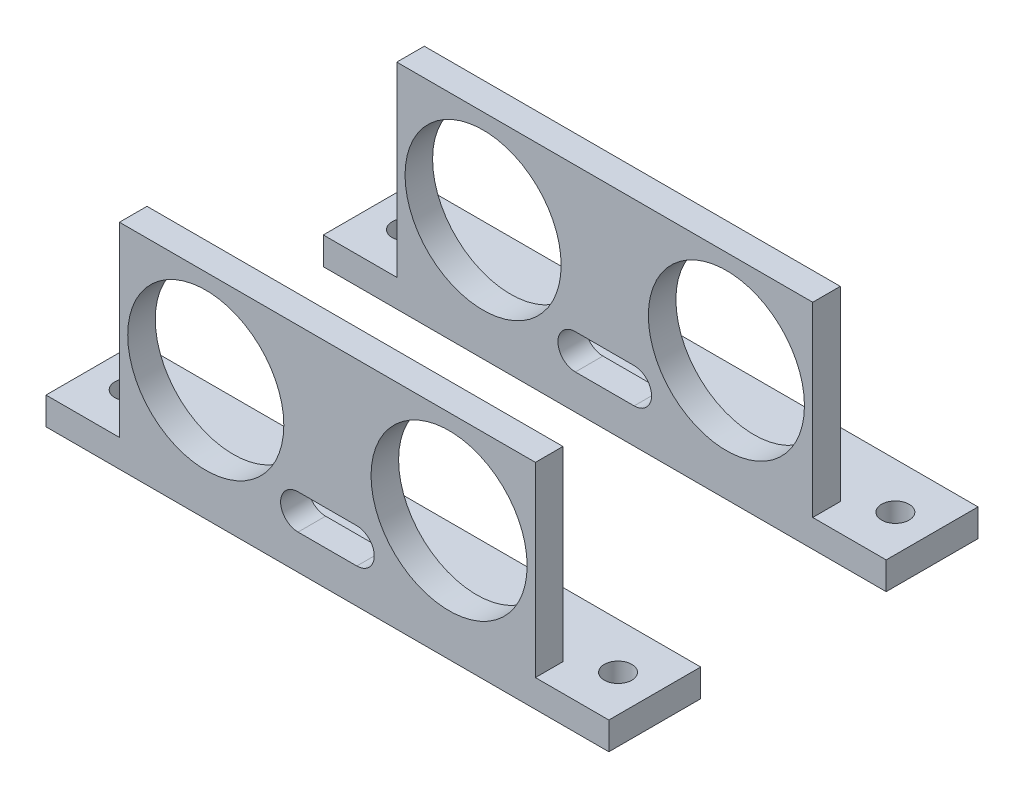
ISO-10303-21;
HEADER;
FILE_DESCRIPTION(('STEP AP214'),'2;1');
FILE_NAME('part.step','',(''),(''),'','','');
FILE_SCHEMA(('AUTOMOTIVE_DESIGN { 1 0 10303 214 1 1 1 1 }'));
ENDSEC;
DATA;
#1=APPLICATION_CONTEXT('core data for automotive mechanical design processes');
#2=APPLICATION_PROTOCOL_DEFINITION('international standard','automotive_design',2000,#1);
#3=PRODUCT_CONTEXT('',#1,'mechanical');
#4=PRODUCT('Part','Part','',(#3));
#5=PRODUCT_RELATED_PRODUCT_CATEGORY('part','',(#4));
#6=PRODUCT_DEFINITION_FORMATION('','',#4);
#7=PRODUCT_DEFINITION_CONTEXT('part definition',#1,'design');
#8=PRODUCT_DEFINITION('design','',#6,#7);
#9=PRODUCT_DEFINITION_SHAPE('','',#8);
#10=(LENGTH_UNIT() NAMED_UNIT(*) SI_UNIT(.MILLI.,.METRE.));
#11=(NAMED_UNIT(*) PLANE_ANGLE_UNIT() SI_UNIT($,.RADIAN.));
#12=(NAMED_UNIT(*) SI_UNIT($,.STERADIAN.) SOLID_ANGLE_UNIT());
#13=UNCERTAINTY_MEASURE_WITH_UNIT(LENGTH_MEASURE(1.E-05),#10,'distance_accuracy_value','');
#14=(GEOMETRIC_REPRESENTATION_CONTEXT(3) GLOBAL_UNCERTAINTY_ASSIGNED_CONTEXT((#13)) GLOBAL_UNIT_ASSIGNED_CONTEXT((#10,
#11,#12)) REPRESENTATION_CONTEXT('',''));
#15=CARTESIAN_POINT('',(0.,0.,0.));
#16=DIRECTION('',(0.,0.,1.));
#17=DIRECTION('',(1.,0.,0.));
#18=AXIS2_PLACEMENT_3D('',#15,#16,#17);
#19=CARTESIAN_POINT('',(98.6393724543672,-8.15776135163671,-20.2023665573039));
#20=DIRECTION('',(0.,-1.,0.));
#21=DIRECTION('',(1.,0.,0.));
#22=AXIS2_PLACEMENT_3D('',#19,#20,#21);
#23=PLANE('',#22);
#24=CARTESIAN_POINT('',(-57.3606275456328,-8.15776135163673,-25.2023665573039));
#25=DIRECTION('',(0.,-1.,0.));
#26=DIRECTION('',(1.,0.,0.));
#27=AXIS2_PLACEMENT_3D('',#24,#25,#26);
#28=CIRCLE('',#27,1.5);
#29=CARTESIAN_POINT('',(-55.8606275456328,-8.15776135163673,-25.2023665573039));
#30=VERTEX_POINT('',#29);
#31=EDGE_CURVE('E161',#30,#30,#28,.T.);
#32=ORIENTED_EDGE('',*,*,#31,.T.);
#33=EDGE_LOOP('',(#32));
#34=FACE_BOUND('',#33,.T.);
#35=CARTESIAN_POINT('',(-4.06062754563281,-8.15776135163673,-25.2023665573039));
#36=DIRECTION('',(0.,-1.,0.));
#37=DIRECTION('',(1.,0.,0.));
#38=AXIS2_PLACEMENT_3D('',#35,#36,#37);
#39=CIRCLE('',#38,1.5);
#40=CARTESIAN_POINT('',(-2.56062754563281,-8.15776135163673,-25.2023665573039));
#41=VERTEX_POINT('',#40);
#42=EDGE_CURVE('E247',#41,#41,#39,.T.);
#43=ORIENTED_EDGE('',*,*,#42,.T.);
#44=EDGE_LOOP('',(#43));
#45=FACE_BOUND('',#44,.T.);
#46=DIRECTION('',(-1.,0.,0.));
#47=VECTOR('',#46,1.);
#48=CARTESIAN_POINT('',(98.6393724543672,-8.15776135163671,-30.2023665573039));
#49=LINE('',#48,#47);
#50=CARTESIAN_POINT('',(-0.0606275456328146,-8.15776135163673,-30.2023665573039));
#51=VERTEX_POINT('',#50);
#52=CARTESIAN_POINT('',(-61.3606275456328,-8.15776135163673,-30.2023665573039));
#53=VERTEX_POINT('',#52);
#54=EDGE_CURVE('E150',#51,#53,#49,.T.);
#55=ORIENTED_EDGE('',*,*,#54,.T.);
#56=DIRECTION('',(0.,0.,-1.));
#57=VECTOR('',#56,1.);
#58=CARTESIAN_POINT('',(-61.3606275456328,-8.15776135163673,-30.2023665573039));
#59=LINE('',#58,#57);
#60=CARTESIAN_POINT('',(-61.3606275456328,-8.15776135163673,-20.2023665573039));
#61=VERTEX_POINT('',#60);
#62=EDGE_CURVE('E168',#61,#53,#59,.T.);
#63=ORIENTED_EDGE('',*,*,#62,.F.);
#64=DIRECTION('',(-1.,0.,0.));
#65=VECTOR('',#64,1.);
#66=CARTESIAN_POINT('',(-53.3606275456328,-8.15776135163673,-20.2023665573039));
#67=LINE('',#66,#65);
#68=CARTESIAN_POINT('',(-53.3606275456328,-8.15776135163673,-20.2023665573039));
#69=VERTEX_POINT('',#68);
#70=EDGE_CURVE('E65',#69,#61,#67,.T.);
#71=ORIENTED_EDGE('',*,*,#70,.F.);
#72=DIRECTION('',(0.,0.,1.));
#73=VECTOR('',#72,1.);
#74=CARTESIAN_POINT('',(-53.3606275456328,-8.15776135163673,-30.2023665573039));
#75=LINE('',#74,#73);
#76=CARTESIAN_POINT('',(-53.3606275456328,-8.15776135163673,-23.2023665573039));
#77=VERTEX_POINT('',#76);
#78=EDGE_CURVE('E12',#77,#69,#75,.T.);
#79=ORIENTED_EDGE('',*,*,#78,.F.);
#80=DIRECTION('',(-1.,0.,0.));
#81=VECTOR('',#80,1.);
#82=CARTESIAN_POINT('',(-53.3606275456328,-8.15776135163673,-23.2023665573039));
#83=LINE('',#82,#81);
#84=CARTESIAN_POINT('',(-8.06062754563281,-8.15776135163673,-23.2023665573039));
#85=VERTEX_POINT('',#84);
#86=EDGE_CURVE('E221',#85,#77,#83,.T.);
#87=ORIENTED_EDGE('',*,*,#86,.F.);
#88=DIRECTION('',(0.,0.,-1.));
#89=VECTOR('',#88,1.);
#90=CARTESIAN_POINT('',(-8.06062754563281,-8.15776135163673,-30.2023665573039));
#91=LINE('',#90,#89);
#92=CARTESIAN_POINT('',(-8.06062754563281,-8.15776135163673,-20.2023665573039));
#93=VERTEX_POINT('',#92);
#94=EDGE_CURVE('E166',#93,#85,#91,.T.);
#95=ORIENTED_EDGE('',*,*,#94,.F.);
#96=DIRECTION('',(-1.,0.,0.));
#97=VECTOR('',#96,1.);
#98=CARTESIAN_POINT('',(-0.0606275456328146,-8.15776135163673,-20.2023665573039));
#99=LINE('',#98,#97);
#100=CARTESIAN_POINT('',(-0.0606275456328146,-8.15776135163673,-20.2023665573039));
#101=VERTEX_POINT('',#100);
#102=EDGE_CURVE('E173',#101,#93,#99,.T.);
#103=ORIENTED_EDGE('',*,*,#102,.F.);
#104=DIRECTION('',(0.,0.,1.));
#105=VECTOR('',#104,1.);
#106=CARTESIAN_POINT('',(-0.0606275456328146,-8.15776135163673,-30.2023665573039));
#107=LINE('',#106,#105);
#108=EDGE_CURVE('E158',#51,#101,#107,.T.);
#109=ORIENTED_EDGE('',*,*,#108,.F.);
#110=EDGE_LOOP('',(#55,#63,#71,#79,#87,#95,#103,#109));
#111=FACE_BOUND('',#110,.T.);
#112=ADVANCED_FACE('F48',(#34,#45,#111),#23,.F.);
#113=CARTESIAN_POINT('',(98.6393724543672,-11.1577613516367,-20.2023665573039));
#114=DIRECTION('',(0.,1.,0.));
#115=DIRECTION('',(-1.,0.,0.));
#116=AXIS2_PLACEMENT_3D('',#113,#114,#115);
#117=PLANE('',#116);
#118=CARTESIAN_POINT('',(-57.3606275456328,-11.1577613516367,-25.2023665573039));
#119=DIRECTION('',(0.,1.,0.));
#120=DIRECTION('',(-1.,0.,0.));
#121=AXIS2_PLACEMENT_3D('',#118,#119,#120);
#122=CIRCLE('',#121,1.5);
#123=CARTESIAN_POINT('',(-58.8606275456328,-11.1577613516367,-25.2023665573039));
#124=VERTEX_POINT('',#123);
#125=EDGE_CURVE('E52',#124,#124,#122,.T.);
#126=ORIENTED_EDGE('',*,*,#125,.T.);
#127=EDGE_LOOP('',(#126));
#128=FACE_BOUND('',#127,.T.);
#129=CARTESIAN_POINT('',(-4.06062754563281,-11.1577613516367,-25.2023665573039));
#130=DIRECTION('',(0.,1.,0.));
#131=DIRECTION('',(-1.,0.,0.));
#132=AXIS2_PLACEMENT_3D('',#129,#130,#131);
#133=CIRCLE('',#132,1.5);
#134=CARTESIAN_POINT('',(-5.56062754563281,-11.1577613516367,-25.2023665573039));
#135=VERTEX_POINT('',#134);
#136=EDGE_CURVE('E245',#135,#135,#133,.T.);
#137=ORIENTED_EDGE('',*,*,#136,.T.);
#138=EDGE_LOOP('',(#137));
#139=FACE_BOUND('',#138,.T.);
#140=DIRECTION('',(1.,0.,0.));
#141=VECTOR('',#140,1.);
#142=CARTESIAN_POINT('',(98.6393724543672,-11.1577613516367,-20.2023665573039));
#143=LINE('',#142,#141);
#144=CARTESIAN_POINT('',(-61.3606275456328,-11.1577613516367,-20.2023665573039));
#145=VERTEX_POINT('',#144);
#146=CARTESIAN_POINT('',(-0.0606275456328142,-11.1577613516367,-20.2023665573039));
#147=VERTEX_POINT('',#146);
#148=EDGE_CURVE('E57',#145,#147,#143,.T.);
#149=ORIENTED_EDGE('',*,*,#148,.F.);
#150=DIRECTION('',(0.,0.,-1.));
#151=VECTOR('',#150,1.);
#152=CARTESIAN_POINT('',(-61.3606275456328,-11.1577613516367,-30.2023665573039));
#153=LINE('',#152,#151);
#154=CARTESIAN_POINT('',(-61.3606275456328,-11.1577613516367,-30.2023665573039));
#155=VERTEX_POINT('',#154);
#156=EDGE_CURVE('E165',#145,#155,#153,.T.);
#157=ORIENTED_EDGE('',*,*,#156,.T.);
#158=DIRECTION('',(1.,0.,0.));
#159=VECTOR('',#158,1.);
#160=CARTESIAN_POINT('',(98.6393724543672,-11.1577613516367,-30.2023665573039));
#161=LINE('',#160,#159);
#162=CARTESIAN_POINT('',(-0.0606275456328142,-11.1577613516367,-30.2023665573039));
#163=VERTEX_POINT('',#162);
#164=EDGE_CURVE('E163',#155,#163,#161,.T.);
#165=ORIENTED_EDGE('',*,*,#164,.T.);
#166=DIRECTION('',(0.,0.,1.));
#167=VECTOR('',#166,1.);
#168=CARTESIAN_POINT('',(-0.0606275456328142,-11.1577613516367,-30.2023665573039));
#169=LINE('',#168,#167);
#170=EDGE_CURVE('E156',#163,#147,#169,.T.);
#171=ORIENTED_EDGE('',*,*,#170,.T.);
#172=EDGE_LOOP('',(#149,#157,#165,#171));
#173=FACE_BOUND('',#172,.T.);
#174=ADVANCED_FACE('F50',(#128,#139,#173),#117,.F.);
#175=CARTESIAN_POINT('',(0.,0.,-20.2023665573039));
#176=DIRECTION('',(0.,0.,1.));
#177=DIRECTION('',(1.,0.,0.));
#178=AXIS2_PLACEMENT_3D('',#175,#176,#177);
#179=PLANE('',#178);
#180=DIRECTION('',(0.,-1.,0.));
#181=VECTOR('',#180,1.);
#182=CARTESIAN_POINT('',(-53.3606275456328,12.1422386483633,-20.2023665573039));
#183=LINE('',#182,#181);
#184=CARTESIAN_POINT('',(-53.3606275456328,12.1422386483633,-20.2023665573039));
#185=VERTEX_POINT('',#184);
#186=EDGE_CURVE('E236',#185,#69,#183,.T.);
#187=ORIENTED_EDGE('',*,*,#186,.T.);
#188=ORIENTED_EDGE('',*,*,#70,.T.);
#189=DIRECTION('',(0.,-1.,0.));
#190=VECTOR('',#189,1.);
#191=CARTESIAN_POINT('',(-61.3606275456328,-8.15776135163673,-20.2023665573039));
#192=LINE('',#191,#190);
#193=EDGE_CURVE('E145',#61,#145,#192,.T.);
#194=ORIENTED_EDGE('',*,*,#193,.T.);
#195=ORIENTED_EDGE('',*,*,#148,.T.);
#196=DIRECTION('',(0.,-1.,0.));
#197=VECTOR('',#196,1.);
#198=CARTESIAN_POINT('',(-0.0606275456328146,-8.15776135163673,-20.2023665573039));
#199=LINE('',#198,#197);
#200=EDGE_CURVE('E143',#101,#147,#199,.T.);
#201=ORIENTED_EDGE('',*,*,#200,.F.);
#202=ORIENTED_EDGE('',*,*,#102,.T.);
#203=DIRECTION('',(0.,-1.,0.));
#204=VECTOR('',#203,1.);
#205=CARTESIAN_POINT('',(-8.06062754563283,12.1422386483633,-20.2023665573039));
#206=LINE('',#205,#204);
#207=CARTESIAN_POINT('',(-8.06062754563283,12.1422386483633,-20.2023665573039));
#208=VERTEX_POINT('',#207);
#209=EDGE_CURVE('E231',#208,#93,#206,.T.);
#210=ORIENTED_EDGE('',*,*,#209,.F.);
#211=DIRECTION('',(1.,0.,0.));
#212=VECTOR('',#211,1.);
#213=CARTESIAN_POINT('',(-53.3606275456328,12.1422386483633,-20.2023665573039));
#214=LINE('',#213,#212);
#215=EDGE_CURVE('E229',#185,#208,#214,.T.);
#216=ORIENTED_EDGE('',*,*,#215,.F.);
#217=EDGE_LOOP('',(#187,#188,#194,#195,#201,#202,#210,#216));
#218=FACE_BOUND('',#217,.T.);
#219=CARTESIAN_POINT('',(-43.9606275456328,1.94223864836327,-20.2023665573039));
#220=DIRECTION('',(0.,0.,1.));
#221=DIRECTION('',(1.,0.,0.));
#222=AXIS2_PLACEMENT_3D('',#219,#220,#221);
#223=CIRCLE('',#222,8.5);
#224=CARTESIAN_POINT('',(-35.4606275456328,1.94223864836327,-20.2023665573039));
#225=VERTEX_POINT('',#224);
#226=EDGE_CURVE('E218',#225,#225,#223,.T.);
#227=ORIENTED_EDGE('',*,*,#226,.F.);
#228=EDGE_LOOP('',(#227));
#229=FACE_BOUND('',#228,.T.);
#230=CARTESIAN_POINT('',(-27.5106275456328,-5.45776135163673,-20.2023665573039));
#231=DIRECTION('',(0.,0.,1.));
#232=DIRECTION('',(1.,0.,0.));
#233=AXIS2_PLACEMENT_3D('',#230,#231,#232);
#234=CIRCLE('',#233,1.9);
#235=CARTESIAN_POINT('',(-27.5106275456328,-7.35776135163673,-20.2023665573039));
#236=VERTEX_POINT('',#235);
#237=CARTESIAN_POINT('',(-27.5106275456328,-3.55776135163673,-20.2023665573039));
#238=VERTEX_POINT('',#237);
#239=EDGE_CURVE('E216',#236,#238,#234,.T.);
#240=ORIENTED_EDGE('',*,*,#239,.F.);
#241=DIRECTION('',(1.,0.,0.));
#242=VECTOR('',#241,1.);
#243=CARTESIAN_POINT('',(0.,-7.35776135163673,-20.2023665573039));
#244=LINE('',#243,#242);
#245=CARTESIAN_POINT('',(-33.9106275456328,-7.35776135163673,-20.2023665573039));
#246=VERTEX_POINT('',#245);
#247=EDGE_CURVE('E210',#246,#236,#244,.T.);
#248=ORIENTED_EDGE('',*,*,#247,.F.);
#249=CARTESIAN_POINT('',(-33.9106275456328,-5.45776135163673,-20.2023665573039));
#250=DIRECTION('',(0.,0.,1.));
#251=DIRECTION('',(1.,0.,0.));
#252=AXIS2_PLACEMENT_3D('',#249,#250,#251);
#253=CIRCLE('',#252,1.9);
#254=CARTESIAN_POINT('',(-33.9106275456328,-3.55776135163673,-20.2023665573039));
#255=VERTEX_POINT('',#254);
#256=EDGE_CURVE('E212',#255,#246,#253,.T.);
#257=ORIENTED_EDGE('',*,*,#256,.F.);
#258=DIRECTION('',(-1.,0.,0.));
#259=VECTOR('',#258,1.);
#260=CARTESIAN_POINT('',(0.,-3.55776135163673,-20.2023665573039));
#261=LINE('',#260,#259);
#262=EDGE_CURVE('E214',#238,#255,#261,.T.);
#263=ORIENTED_EDGE('',*,*,#262,.F.);
#264=EDGE_LOOP('',(#240,#248,#257,#263));
#265=FACE_BOUND('',#264,.T.);
#266=CARTESIAN_POINT('',(-17.4606275456328,1.94223864836327,-20.2023665573039));
#267=DIRECTION('',(0.,0.,1.));
#268=DIRECTION('',(1.,0.,0.));
#269=AXIS2_PLACEMENT_3D('',#266,#267,#268);
#270=CIRCLE('',#269,8.5);
#271=CARTESIAN_POINT('',(-8.96062754563282,1.94223864836327,-20.2023665573039));
#272=VERTEX_POINT('',#271);
#273=EDGE_CURVE('E207',#272,#272,#270,.T.);
#274=ORIENTED_EDGE('',*,*,#273,.F.);
#275=EDGE_LOOP('',(#274));
#276=FACE_BOUND('',#275,.T.);
#277=ADVANCED_FACE('F140',(#218,#229,#265,#276),#179,.T.);
#278=CARTESIAN_POINT('',(0.,0.,-30.2023665573039));
#279=DIRECTION('',(0.,0.,1.));
#280=DIRECTION('',(1.,0.,0.));
#281=AXIS2_PLACEMENT_3D('',#278,#279,#280);
#282=PLANE('',#281);
#283=ORIENTED_EDGE('',*,*,#164,.F.);
#284=DIRECTION('',(0.,-1.,0.));
#285=VECTOR('',#284,1.);
#286=CARTESIAN_POINT('',(-61.3606275456328,-8.15776135163673,-30.2023665573039));
#287=LINE('',#286,#285);
#288=EDGE_CURVE('E178',#53,#155,#287,.T.);
#289=ORIENTED_EDGE('',*,*,#288,.F.);
#290=ORIENTED_EDGE('',*,*,#54,.F.);
#291=DIRECTION('',(0.,-1.,0.));
#292=VECTOR('',#291,1.);
#293=CARTESIAN_POINT('',(-0.0606275456328146,-8.15776135163673,-30.2023665573039));
#294=LINE('',#293,#292);
#295=EDGE_CURVE('E160',#51,#163,#294,.T.);
#296=ORIENTED_EDGE('',*,*,#295,.T.);
#297=EDGE_LOOP('',(#283,#289,#290,#296));
#298=FACE_BOUND('',#297,.T.);
#299=ADVANCED_FACE('F258',(#298),#282,.F.);
#300=CARTESIAN_POINT('',(-8.06062754563283,12.1422386483633,-23.2023665573039));
#301=DIRECTION('',(-1.,0.,0.));
#302=DIRECTION('',(0.,-1.,0.));
#303=AXIS2_PLACEMENT_3D('',#300,#301,#302);
#304=PLANE('',#303);
#305=ORIENTED_EDGE('',*,*,#209,.T.);
#306=ORIENTED_EDGE('',*,*,#94,.T.);
#307=DIRECTION('',(0.,-1.,0.));
#308=VECTOR('',#307,1.);
#309=CARTESIAN_POINT('',(-8.06062754563283,12.1422386483633,-23.2023665573039));
#310=LINE('',#309,#308);
#311=CARTESIAN_POINT('',(-8.06062754563283,12.1422386483633,-23.2023665573039));
#312=VERTEX_POINT('',#311);
#313=EDGE_CURVE('E241',#312,#85,#310,.T.);
#314=ORIENTED_EDGE('',*,*,#313,.F.);
#315=DIRECTION('',(0.,0.,-1.));
#316=VECTOR('',#315,1.);
#317=CARTESIAN_POINT('',(-8.06062754563283,12.1422386483633,-23.2023665573039));
#318=LINE('',#317,#316);
#319=EDGE_CURVE('E222',#208,#312,#318,.T.);
#320=ORIENTED_EDGE('',*,*,#319,.F.);
#321=EDGE_LOOP('',(#305,#306,#314,#320));
#322=FACE_BOUND('',#321,.T.);
#323=ADVANCED_FACE('F265',(#322),#304,.F.);
#324=CARTESIAN_POINT('',(-53.3606275456328,12.1422386483633,-23.2023665573039));
#325=DIRECTION('',(0.,0.,1.));
#326=DIRECTION('',(1.,0.,0.));
#327=AXIS2_PLACEMENT_3D('',#324,#325,#326);
#328=PLANE('',#327);
#329=CARTESIAN_POINT('',(-43.9606275456328,1.94223864836327,-23.2023665573039));
#330=DIRECTION('',(0.,0.,-1.));
#331=DIRECTION('',(-1.,0.,0.));
#332=AXIS2_PLACEMENT_3D('',#329,#330,#331);
#333=CIRCLE('',#332,8.5);
#334=CARTESIAN_POINT('',(-52.4606275456328,1.94223864836327,-23.2023665573039));
#335=VERTEX_POINT('',#334);
#336=EDGE_CURVE('E201',#335,#335,#333,.T.);
#337=ORIENTED_EDGE('',*,*,#336,.F.);
#338=EDGE_LOOP('',(#337));
#339=FACE_BOUND('',#338,.T.);
#340=DIRECTION('',(-1.,0.,0.));
#341=VECTOR('',#340,1.);
#342=CARTESIAN_POINT('',(-27.5106275456328,-7.35776135163673,-23.2023665573039));
#343=LINE('',#342,#341);
#344=CARTESIAN_POINT('',(-27.5106275456328,-7.35776135163673,-23.2023665573039));
#345=VERTEX_POINT('',#344);
#346=CARTESIAN_POINT('',(-33.9106275456328,-7.35776135163673,-23.2023665573039));
#347=VERTEX_POINT('',#346);
#348=EDGE_CURVE('E197',#345,#347,#343,.T.);
#349=ORIENTED_EDGE('',*,*,#348,.F.);
#350=CARTESIAN_POINT('',(-27.5106275456328,-5.45776135163673,-23.2023665573039));
#351=DIRECTION('',(0.,0.,-1.));
#352=DIRECTION('',(-1.,0.,0.));
#353=AXIS2_PLACEMENT_3D('',#350,#351,#352);
#354=CIRCLE('',#353,1.9);
#355=CARTESIAN_POINT('',(-27.5106275456328,-3.55776135163673,-23.2023665573039));
#356=VERTEX_POINT('',#355);
#357=EDGE_CURVE('E199',#356,#345,#354,.T.);
#358=ORIENTED_EDGE('',*,*,#357,.F.);
#359=DIRECTION('',(1.,0.,0.));
#360=VECTOR('',#359,1.);
#361=CARTESIAN_POINT('',(-27.5106275456328,-3.55776135163673,-23.2023665573039));
#362=LINE('',#361,#360);
#363=CARTESIAN_POINT('',(-33.9106275456328,-3.55776135163673,-23.2023665573039));
#364=VERTEX_POINT('',#363);
#365=EDGE_CURVE('E187',#364,#356,#362,.T.);
#366=ORIENTED_EDGE('',*,*,#365,.F.);
#367=CARTESIAN_POINT('',(-33.9106275456328,-5.45776135163673,-23.2023665573039));
#368=DIRECTION('',(0.,0.,-1.));
#369=DIRECTION('',(-1.,0.,0.));
#370=AXIS2_PLACEMENT_3D('',#367,#368,#369);
#371=CIRCLE('',#370,1.9);
#372=EDGE_CURVE('E194',#347,#364,#371,.T.);
#373=ORIENTED_EDGE('',*,*,#372,.F.);
#374=EDGE_LOOP('',(#349,#358,#366,#373));
#375=FACE_BOUND('',#374,.T.);
#376=CARTESIAN_POINT('',(-17.4606275456328,1.94223864836327,-23.2023665573039));
#377=DIRECTION('',(0.,0.,-1.));
#378=DIRECTION('',(-1.,0.,0.));
#379=AXIS2_PLACEMENT_3D('',#376,#377,#378);
#380=CIRCLE('',#379,8.5);
#381=CARTESIAN_POINT('',(-25.9606275456328,1.94223864836327,-23.2023665573039));
#382=VERTEX_POINT('',#381);
#383=EDGE_CURVE('E204',#382,#382,#380,.T.);
#384=ORIENTED_EDGE('',*,*,#383,.F.);
#385=EDGE_LOOP('',(#384));
#386=FACE_BOUND('',#385,.T.);
#387=ORIENTED_EDGE('',*,*,#86,.T.);
#388=DIRECTION('',(0.,-1.,0.));
#389=VECTOR('',#388,1.);
#390=CARTESIAN_POINT('',(-53.3606275456328,12.1422386483633,-23.2023665573039));
#391=LINE('',#390,#389);
#392=CARTESIAN_POINT('',(-53.3606275456328,12.1422386483633,-23.2023665573039));
#393=VERTEX_POINT('',#392);
#394=EDGE_CURVE('E238',#393,#77,#391,.T.);
#395=ORIENTED_EDGE('',*,*,#394,.F.);
#396=DIRECTION('',(-1.,0.,0.));
#397=VECTOR('',#396,1.);
#398=CARTESIAN_POINT('',(-53.3606275456328,12.1422386483633,-23.2023665573039));
#399=LINE('',#398,#397);
#400=EDGE_CURVE('E225',#312,#393,#399,.T.);
#401=ORIENTED_EDGE('',*,*,#400,.F.);
#402=ORIENTED_EDGE('',*,*,#313,.T.);
#403=EDGE_LOOP('',(#387,#395,#401,#402));
#404=FACE_BOUND('',#403,.T.);
#405=ADVANCED_FACE('F275',(#339,#375,#386,#404),#328,.F.);
#406=CARTESIAN_POINT('',(-53.3606275456328,12.1422386483633,-23.2023665573039));
#407=DIRECTION('',(1.,0.,0.));
#408=DIRECTION('',(0.,1.,0.));
#409=AXIS2_PLACEMENT_3D('',#406,#407,#408);
#410=PLANE('',#409);
#411=ORIENTED_EDGE('',*,*,#394,.T.);
#412=ORIENTED_EDGE('',*,*,#78,.T.);
#413=ORIENTED_EDGE('',*,*,#186,.F.);
#414=DIRECTION('',(0.,0.,1.));
#415=VECTOR('',#414,1.);
#416=CARTESIAN_POINT('',(-53.3606275456328,12.1422386483633,-23.2023665573039));
#417=LINE('',#416,#415);
#418=EDGE_CURVE('E227',#393,#185,#417,.T.);
#419=ORIENTED_EDGE('',*,*,#418,.F.);
#420=EDGE_LOOP('',(#411,#412,#413,#419));
#421=FACE_BOUND('',#420,.T.);
#422=ADVANCED_FACE('F273',(#421),#410,.F.);
#423=CARTESIAN_POINT('',(0.,12.1422386483633,-30.2023665573039));
#424=DIRECTION('',(0.,1.,0.));
#425=DIRECTION('',(-1.,0.,0.));
#426=AXIS2_PLACEMENT_3D('',#423,#424,#425);
#427=PLANE('',#426);
#428=ORIENTED_EDGE('',*,*,#319,.T.);
#429=ORIENTED_EDGE('',*,*,#400,.T.);
#430=ORIENTED_EDGE('',*,*,#418,.T.);
#431=ORIENTED_EDGE('',*,*,#215,.T.);
#432=EDGE_LOOP('',(#428,#429,#430,#431));
#433=FACE_BOUND('',#432,.T.);
#434=ADVANCED_FACE('F268',(#433),#427,.T.);
#435=CARTESIAN_POINT('',(-17.4606275456328,1.94223864836327,-2.90236655730386));
#436=DIRECTION('',(0.,0.,-1.));
#437=DIRECTION('',(-1.,0.,0.));
#438=AXIS2_PLACEMENT_3D('',#435,#436,#437);
#439=CYLINDRICAL_SURFACE('',#438,8.5);
#440=ORIENTED_EDGE('',*,*,#273,.T.);
#441=EDGE_LOOP('',(#440));
#442=FACE_BOUND('',#441,.T.);
#443=ORIENTED_EDGE('',*,*,#383,.T.);
#444=EDGE_LOOP('',(#443));
#445=FACE_BOUND('',#444,.T.);
#446=ADVANCED_FACE('F337',(#442,#445),#439,.F.);
#447=CARTESIAN_POINT('',(-27.5106275456328,-5.45776135163673,-2.90236655730386));
#448=DIRECTION('',(0.,0.,-1.));
#449=DIRECTION('',(-1.,0.,0.));
#450=AXIS2_PLACEMENT_3D('',#447,#448,#449);
#451=CYLINDRICAL_SURFACE('',#450,1.9);
#452=ORIENTED_EDGE('',*,*,#239,.T.);
#453=DIRECTION('',(0.,0.,-1.));
#454=VECTOR('',#453,1.);
#455=CARTESIAN_POINT('',(-27.5106275456328,-3.55776135163673,-2.90236655730386));
#456=LINE('',#455,#454);
#457=EDGE_CURVE('E181',#238,#356,#456,.T.);
#458=ORIENTED_EDGE('',*,*,#457,.T.);
#459=ORIENTED_EDGE('',*,*,#357,.T.);
#460=DIRECTION('',(0.,0.,-1.));
#461=VECTOR('',#460,1.);
#462=CARTESIAN_POINT('',(-27.5106275456328,-7.35776135163673,-2.90236655730386));
#463=LINE('',#462,#461);
#464=EDGE_CURVE('E184',#236,#345,#463,.T.);
#465=ORIENTED_EDGE('',*,*,#464,.F.);
#466=EDGE_LOOP('',(#452,#458,#459,#465));
#467=FACE_BOUND('',#466,.T.);
#468=ADVANCED_FACE('F346',(#467),#451,.F.);
#469=CARTESIAN_POINT('',(-27.5106275456328,-3.55776135163673,-2.90236655730386));
#470=DIRECTION('',(0.,1.,0.));
#471=DIRECTION('',(0.,0.,1.));
#472=AXIS2_PLACEMENT_3D('',#469,#470,#471);
#473=PLANE('',#472);
#474=ORIENTED_EDGE('',*,*,#262,.T.);
#475=DIRECTION('',(0.,0.,-1.));
#476=VECTOR('',#475,1.);
#477=CARTESIAN_POINT('',(-33.9106275456328,-3.55776135163673,-2.90236655730386));
#478=LINE('',#477,#476);
#479=EDGE_CURVE('E189',#255,#364,#478,.T.);
#480=ORIENTED_EDGE('',*,*,#479,.T.);
#481=ORIENTED_EDGE('',*,*,#365,.T.);
#482=ORIENTED_EDGE('',*,*,#457,.F.);
#483=EDGE_LOOP('',(#474,#480,#481,#482));
#484=FACE_BOUND('',#483,.T.);
#485=ADVANCED_FACE('F356',(#484),#473,.F.);
#486=CARTESIAN_POINT('',(-33.9106275456328,-5.45776135163673,-2.90236655730386));
#487=DIRECTION('',(0.,0.,-1.));
#488=DIRECTION('',(-1.,0.,0.));
#489=AXIS2_PLACEMENT_3D('',#486,#487,#488);
#490=CYLINDRICAL_SURFACE('',#489,1.9);
#491=ORIENTED_EDGE('',*,*,#256,.T.);
#492=DIRECTION('',(0.,0.,-1.));
#493=VECTOR('',#492,1.);
#494=CARTESIAN_POINT('',(-33.9106275456328,-7.35776135163673,-2.90236655730386));
#495=LINE('',#494,#493);
#496=EDGE_CURVE('E72',#246,#347,#495,.T.);
#497=ORIENTED_EDGE('',*,*,#496,.T.);
#498=ORIENTED_EDGE('',*,*,#372,.T.);
#499=ORIENTED_EDGE('',*,*,#479,.F.);
#500=EDGE_LOOP('',(#491,#497,#498,#499));
#501=FACE_BOUND('',#500,.T.);
#502=ADVANCED_FACE('F366',(#501),#490,.F.);
#503=CARTESIAN_POINT('',(-27.5106275456328,-7.35776135163673,-2.90236655730386));
#504=DIRECTION('',(0.,-1.,0.));
#505=DIRECTION('',(0.,0.,-1.));
#506=AXIS2_PLACEMENT_3D('',#503,#504,#505);
#507=PLANE('',#506);
#508=ORIENTED_EDGE('',*,*,#247,.T.);
#509=ORIENTED_EDGE('',*,*,#464,.T.);
#510=ORIENTED_EDGE('',*,*,#348,.T.);
#511=ORIENTED_EDGE('',*,*,#496,.F.);
#512=EDGE_LOOP('',(#508,#509,#510,#511));
#513=FACE_BOUND('',#512,.T.);
#514=ADVANCED_FACE('F376',(#513),#507,.F.);
#515=CARTESIAN_POINT('',(-43.9606275456328,1.94223864836327,-2.90236655730386));
#516=DIRECTION('',(0.,0.,-1.));
#517=DIRECTION('',(-1.,0.,0.));
#518=AXIS2_PLACEMENT_3D('',#515,#516,#517);
#519=CYLINDRICAL_SURFACE('',#518,8.5);
#520=ORIENTED_EDGE('',*,*,#226,.T.);
#521=EDGE_LOOP('',(#520));
#522=FACE_BOUND('',#521,.T.);
#523=ORIENTED_EDGE('',*,*,#336,.T.);
#524=EDGE_LOOP('',(#523));
#525=FACE_BOUND('',#524,.T.);
#526=ADVANCED_FACE('F386',(#522,#525),#519,.F.);
#527=CARTESIAN_POINT('',(-61.3606275456328,-8.15776135163673,-30.2023665573039));
#528=DIRECTION('',(-1.,0.,0.));
#529=DIRECTION('',(0.,-1.,0.));
#530=AXIS2_PLACEMENT_3D('',#527,#528,#529);
#531=PLANE('',#530);
#532=ORIENTED_EDGE('',*,*,#156,.F.);
#533=ORIENTED_EDGE('',*,*,#193,.F.);
#534=ORIENTED_EDGE('',*,*,#62,.T.);
#535=ORIENTED_EDGE('',*,*,#288,.T.);
#536=EDGE_LOOP('',(#532,#533,#534,#535));
#537=FACE_BOUND('',#536,.T.);
#538=ADVANCED_FACE('F395',(#537),#531,.T.);
#539=CARTESIAN_POINT('',(-0.0606275456328146,-8.15776135163673,-30.2023665573039));
#540=DIRECTION('',(1.,0.,0.));
#541=DIRECTION('',(0.,1.,0.));
#542=AXIS2_PLACEMENT_3D('',#539,#540,#541);
#543=PLANE('',#542);
#544=ORIENTED_EDGE('',*,*,#170,.F.);
#545=ORIENTED_EDGE('',*,*,#295,.F.);
#546=ORIENTED_EDGE('',*,*,#108,.T.);
#547=ORIENTED_EDGE('',*,*,#200,.T.);
#548=EDGE_LOOP('',(#544,#545,#546,#547));
#549=FACE_BOUND('',#548,.T.);
#550=ADVANCED_FACE('F154',(#549),#543,.T.);
#551=CARTESIAN_POINT('',(-4.06062754563282,12.1422386483633,-25.2023665573039));
#552=DIRECTION('',(0.,-1.,0.));
#553=DIRECTION('',(1.,0.,0.));
#554=AXIS2_PLACEMENT_3D('',#551,#552,#553);
#555=CYLINDRICAL_SURFACE('',#554,1.5);
#556=ORIENTED_EDGE('',*,*,#136,.F.);
#557=EDGE_LOOP('',(#556));
#558=FACE_BOUND('',#557,.T.);
#559=ORIENTED_EDGE('',*,*,#42,.F.);
#560=EDGE_LOOP('',(#559));
#561=FACE_BOUND('',#560,.T.);
#562=ADVANCED_FACE('F414',(#558,#561),#555,.F.);
#563=CARTESIAN_POINT('',(-57.3606275456328,12.1422386483633,-25.2023665573039));
#564=DIRECTION('',(0.,-1.,0.));
#565=DIRECTION('',(1.,0.,0.));
#566=AXIS2_PLACEMENT_3D('',#563,#564,#565);
#567=CYLINDRICAL_SURFACE('',#566,1.5);
#568=ORIENTED_EDGE('',*,*,#125,.F.);
#569=EDGE_LOOP('',(#568));
#570=FACE_BOUND('',#569,.T.);
#571=ORIENTED_EDGE('',*,*,#31,.F.);
#572=EDGE_LOOP('',(#571));
#573=FACE_BOUND('',#572,.T.);
#574=ADVANCED_FACE('F424',(#570,#573),#567,.F.);
#575=CLOSED_SHELL('',(#112,#174,#277,#299,#323,#405,#422,#434,#446,#468,#485,#502,#514,#526,
#538,#550,#562,#574));
#576=MANIFOLD_SOLID_BREP('B2',#575);
#577=CARTESIAN_POINT('',(98.6393724543672,-8.15776135163671,10.));
#578=DIRECTION('',(0.,-1.,0.));
#579=DIRECTION('',(1.,0.,0.));
#580=AXIS2_PLACEMENT_3D('',#577,#578,#579);
#581=PLANE('',#580);
#582=CARTESIAN_POINT('',(-57.3606275456328,-8.15776135163673,5.));
#583=DIRECTION('',(0.,-1.,0.));
#584=DIRECTION('',(1.,0.,0.));
#585=AXIS2_PLACEMENT_3D('',#582,#583,#584);
#586=CIRCLE('',#585,1.5);
#587=CARTESIAN_POINT('',(-55.8606275456328,-8.15776135163673,5.));
#588=VERTEX_POINT('',#587);
#589=EDGE_CURVE('E614',#588,#588,#586,.T.);
#590=ORIENTED_EDGE('',*,*,#589,.T.);
#591=EDGE_LOOP('',(#590));
#592=FACE_BOUND('',#591,.T.);
#593=CARTESIAN_POINT('',(-4.06062754563281,-8.15776135163673,5.));
#594=DIRECTION('',(0.,-1.,0.));
#595=DIRECTION('',(1.,0.,0.));
#596=AXIS2_PLACEMENT_3D('',#593,#594,#595);
#597=CIRCLE('',#596,1.5);
#598=CARTESIAN_POINT('',(-2.56062754563281,-8.15776135163673,5.));
#599=VERTEX_POINT('',#598);
#600=EDGE_CURVE('E700',#599,#599,#597,.T.);
#601=ORIENTED_EDGE('',*,*,#600,.T.);
#602=EDGE_LOOP('',(#601));
#603=FACE_BOUND('',#602,.T.);
#604=DIRECTION('',(-1.,0.,0.));
#605=VECTOR('',#604,1.);
#606=CARTESIAN_POINT('',(98.6393724543672,-8.15776135163671,0.));
#607=LINE('',#606,#605);
#608=CARTESIAN_POINT('',(-0.0606275456328146,-8.15776135163673,0.));
#609=VERTEX_POINT('',#608);
#610=CARTESIAN_POINT('',(-61.3606275456328,-8.15776135163673,0.));
#611=VERTEX_POINT('',#610);
#612=EDGE_CURVE('E603',#609,#611,#607,.T.);
#613=ORIENTED_EDGE('',*,*,#612,.T.);
#614=DIRECTION('',(0.,0.,-1.));
#615=VECTOR('',#614,1.);
#616=CARTESIAN_POINT('',(-61.3606275456328,-8.15776135163673,0.));
#617=LINE('',#616,#615);
#618=CARTESIAN_POINT('',(-61.3606275456328,-8.15776135163673,10.));
#619=VERTEX_POINT('',#618);
#620=EDGE_CURVE('E621',#619,#611,#617,.T.);
#621=ORIENTED_EDGE('',*,*,#620,.F.);
#622=DIRECTION('',(-1.,0.,0.));
#623=VECTOR('',#622,1.);
#624=CARTESIAN_POINT('',(-53.3606275456328,-8.15776135163673,10.));
#625=LINE('',#624,#623);
#626=CARTESIAN_POINT('',(-53.3606275456328,-8.15776135163673,10.));
#627=VERTEX_POINT('',#626);
#628=EDGE_CURVE('E518',#627,#619,#625,.T.);
#629=ORIENTED_EDGE('',*,*,#628,.F.);
#630=DIRECTION('',(0.,0.,1.));
#631=VECTOR('',#630,1.);
#632=CARTESIAN_POINT('',(-53.3606275456328,-8.15776135163673,0.));
#633=LINE('',#632,#631);
#634=CARTESIAN_POINT('',(-53.3606275456328,-8.15776135163673,7.));
#635=VERTEX_POINT('',#634);
#636=EDGE_CURVE('E46',#635,#627,#633,.T.);
#637=ORIENTED_EDGE('',*,*,#636,.F.);
#638=DIRECTION('',(-1.,0.,0.));
#639=VECTOR('',#638,1.);
#640=CARTESIAN_POINT('',(-53.3606275456328,-8.15776135163673,7.));
#641=LINE('',#640,#639);
#642=CARTESIAN_POINT('',(-8.06062754563281,-8.15776135163673,7.));
#643=VERTEX_POINT('',#642);
#644=EDGE_CURVE('E674',#643,#635,#641,.T.);
#645=ORIENTED_EDGE('',*,*,#644,.F.);
#646=DIRECTION('',(0.,0.,-1.));
#647=VECTOR('',#646,1.);
#648=CARTESIAN_POINT('',(-8.06062754563281,-8.15776135163673,0.));
#649=LINE('',#648,#647);
#650=CARTESIAN_POINT('',(-8.06062754563281,-8.15776135163673,10.));
#651=VERTEX_POINT('',#650);
#652=EDGE_CURVE('E619',#651,#643,#649,.T.);
#653=ORIENTED_EDGE('',*,*,#652,.F.);
#654=DIRECTION('',(-1.,0.,0.));
#655=VECTOR('',#654,1.);
#656=CARTESIAN_POINT('',(-0.0606275456328146,-8.15776135163673,10.));
#657=LINE('',#656,#655);
#658=CARTESIAN_POINT('',(-0.0606275456328146,-8.15776135163673,10.));
#659=VERTEX_POINT('',#658);
#660=EDGE_CURVE('E626',#659,#651,#657,.T.);
#661=ORIENTED_EDGE('',*,*,#660,.F.);
#662=DIRECTION('',(0.,0.,1.));
#663=VECTOR('',#662,1.);
#664=CARTESIAN_POINT('',(-0.0606275456328146,-8.15776135163673,0.));
#665=LINE('',#664,#663);
#666=EDGE_CURVE('E611',#609,#659,#665,.T.);
#667=ORIENTED_EDGE('',*,*,#666,.F.);
#668=EDGE_LOOP('',(#613,#621,#629,#637,#645,#653,#661,#667));
#669=FACE_BOUND('',#668,.T.);
#670=ADVANCED_FACE('F501',(#592,#603,#669),#581,.F.);
#671=CARTESIAN_POINT('',(98.6393724543672,-11.1577613516367,10.));
#672=DIRECTION('',(0.,1.,0.));
#673=DIRECTION('',(-1.,0.,0.));
#674=AXIS2_PLACEMENT_3D('',#671,#672,#673);
#675=PLANE('',#674);
#676=CARTESIAN_POINT('',(-57.3606275456328,-11.1577613516367,5.));
#677=DIRECTION('',(0.,1.,0.));
#678=DIRECTION('',(-1.,0.,0.));
#679=AXIS2_PLACEMENT_3D('',#676,#677,#678);
#680=CIRCLE('',#679,1.5);
#681=CARTESIAN_POINT('',(-58.8606275456328,-11.1577613516367,5.));
#682=VERTEX_POINT('',#681);
#683=EDGE_CURVE('E505',#682,#682,#680,.T.);
#684=ORIENTED_EDGE('',*,*,#683,.T.);
#685=EDGE_LOOP('',(#684));
#686=FACE_BOUND('',#685,.T.);
#687=CARTESIAN_POINT('',(-4.06062754563281,-11.1577613516367,5.));
#688=DIRECTION('',(0.,1.,0.));
#689=DIRECTION('',(-1.,0.,0.));
#690=AXIS2_PLACEMENT_3D('',#687,#688,#689);
#691=CIRCLE('',#690,1.5);
#692=CARTESIAN_POINT('',(-5.56062754563281,-11.1577613516367,5.));
#693=VERTEX_POINT('',#692);
#694=EDGE_CURVE('E698',#693,#693,#691,.T.);
#695=ORIENTED_EDGE('',*,*,#694,.T.);
#696=EDGE_LOOP('',(#695));
#697=FACE_BOUND('',#696,.T.);
#698=DIRECTION('',(1.,0.,0.));
#699=VECTOR('',#698,1.);
#700=CARTESIAN_POINT('',(98.6393724543672,-11.1577613516367,10.));
#701=LINE('',#700,#699);
#702=CARTESIAN_POINT('',(-61.3606275456328,-11.1577613516367,10.));
#703=VERTEX_POINT('',#702);
#704=CARTESIAN_POINT('',(-0.0606275456328142,-11.1577613516367,10.));
#705=VERTEX_POINT('',#704);
#706=EDGE_CURVE('E510',#703,#705,#701,.T.);
#707=ORIENTED_EDGE('',*,*,#706,.F.);
#708=DIRECTION('',(0.,0.,-1.));
#709=VECTOR('',#708,1.);
#710=CARTESIAN_POINT('',(-61.3606275456328,-11.1577613516367,0.));
#711=LINE('',#710,#709);
#712=CARTESIAN_POINT('',(-61.3606275456328,-11.1577613516367,0.));
#713=VERTEX_POINT('',#712);
#714=EDGE_CURVE('E618',#703,#713,#711,.T.);
#715=ORIENTED_EDGE('',*,*,#714,.T.);
#716=DIRECTION('',(1.,0.,0.));
#717=VECTOR('',#716,1.);
#718=CARTESIAN_POINT('',(98.6393724543672,-11.1577613516367,0.));
#719=LINE('',#718,#717);
#720=CARTESIAN_POINT('',(-0.0606275456328142,-11.1577613516367,0.));
#721=VERTEX_POINT('',#720);
#722=EDGE_CURVE('E616',#713,#721,#719,.T.);
#723=ORIENTED_EDGE('',*,*,#722,.T.);
#724=DIRECTION('',(0.,0.,1.));
#725=VECTOR('',#724,1.);
#726=CARTESIAN_POINT('',(-0.0606275456328142,-11.1577613516367,0.));
#727=LINE('',#726,#725);
#728=EDGE_CURVE('E609',#721,#705,#727,.T.);
#729=ORIENTED_EDGE('',*,*,#728,.T.);
#730=EDGE_LOOP('',(#707,#715,#723,#729));
#731=FACE_BOUND('',#730,.T.);
#732=ADVANCED_FACE('F503',(#686,#697,#731),#675,.F.);
#733=CARTESIAN_POINT('',(0.,0.,10.));
#734=DIRECTION('',(0.,0.,1.));
#735=DIRECTION('',(1.,0.,0.));
#736=AXIS2_PLACEMENT_3D('',#733,#734,#735);
#737=PLANE('',#736);
#738=DIRECTION('',(0.,-1.,0.));
#739=VECTOR('',#738,1.);
#740=CARTESIAN_POINT('',(-53.3606275456328,12.1422386483633,10.));
#741=LINE('',#740,#739);
#742=CARTESIAN_POINT('',(-53.3606275456328,12.1422386483633,10.));
#743=VERTEX_POINT('',#742);
#744=EDGE_CURVE('E689',#743,#627,#741,.T.);
#745=ORIENTED_EDGE('',*,*,#744,.T.);
#746=ORIENTED_EDGE('',*,*,#628,.T.);
#747=DIRECTION('',(0.,-1.,0.));
#748=VECTOR('',#747,1.);
#749=CARTESIAN_POINT('',(-61.3606275456328,-8.15776135163673,10.));
#750=LINE('',#749,#748);
#751=EDGE_CURVE('E598',#619,#703,#750,.T.);
#752=ORIENTED_EDGE('',*,*,#751,.T.);
#753=ORIENTED_EDGE('',*,*,#706,.T.);
#754=DIRECTION('',(0.,-1.,0.));
#755=VECTOR('',#754,1.);
#756=CARTESIAN_POINT('',(-0.0606275456328146,-8.15776135163673,10.));
#757=LINE('',#756,#755);
#758=EDGE_CURVE('E596',#659,#705,#757,.T.);
#759=ORIENTED_EDGE('',*,*,#758,.F.);
#760=ORIENTED_EDGE('',*,*,#660,.T.);
#761=DIRECTION('',(0.,-1.,0.));
#762=VECTOR('',#761,1.);
#763=CARTESIAN_POINT('',(-8.06062754563283,12.1422386483633,10.));
#764=LINE('',#763,#762);
#765=CARTESIAN_POINT('',(-8.06062754563283,12.1422386483633,10.));
#766=VERTEX_POINT('',#765);
#767=EDGE_CURVE('E684',#766,#651,#764,.T.);
#768=ORIENTED_EDGE('',*,*,#767,.F.);
#769=DIRECTION('',(1.,0.,0.));
#770=VECTOR('',#769,1.);
#771=CARTESIAN_POINT('',(-53.3606275456328,12.1422386483633,10.));
#772=LINE('',#771,#770);
#773=EDGE_CURVE('E682',#743,#766,#772,.T.);
#774=ORIENTED_EDGE('',*,*,#773,.F.);
#775=EDGE_LOOP('',(#745,#746,#752,#753,#759,#760,#768,#774));
#776=FACE_BOUND('',#775,.T.);
#777=CARTESIAN_POINT('',(-43.9606275456328,1.94223864836327,10.));
#778=DIRECTION('',(0.,0.,1.));
#779=DIRECTION('',(1.,0.,0.));
#780=AXIS2_PLACEMENT_3D('',#777,#778,#779);
#781=CIRCLE('',#780,8.5);
#782=CARTESIAN_POINT('',(-35.4606275456328,1.94223864836327,10.));
#783=VERTEX_POINT('',#782);
#784=EDGE_CURVE('E671',#783,#783,#781,.T.);
#785=ORIENTED_EDGE('',*,*,#784,.F.);
#786=EDGE_LOOP('',(#785));
#787=FACE_BOUND('',#786,.T.);
#788=CARTESIAN_POINT('',(-27.5106275456328,-5.45776135163673,10.));
#789=DIRECTION('',(0.,0.,1.));
#790=DIRECTION('',(1.,0.,0.));
#791=AXIS2_PLACEMENT_3D('',#788,#789,#790);
#792=CIRCLE('',#791,1.9);
#793=CARTESIAN_POINT('',(-27.5106275456328,-7.35776135163673,10.));
#794=VERTEX_POINT('',#793);
#795=CARTESIAN_POINT('',(-27.5106275456328,-3.55776135163673,10.));
#796=VERTEX_POINT('',#795);
#797=EDGE_CURVE('E669',#794,#796,#792,.T.);
#798=ORIENTED_EDGE('',*,*,#797,.F.);
#799=DIRECTION('',(1.,0.,0.));
#800=VECTOR('',#799,1.);
#801=CARTESIAN_POINT('',(0.,-7.35776135163673,10.));
#802=LINE('',#801,#800);
#803=CARTESIAN_POINT('',(-33.9106275456328,-7.35776135163673,10.));
#804=VERTEX_POINT('',#803);
#805=EDGE_CURVE('E663',#804,#794,#802,.T.);
#806=ORIENTED_EDGE('',*,*,#805,.F.);
#807=CARTESIAN_POINT('',(-33.9106275456328,-5.45776135163673,10.));
#808=DIRECTION('',(0.,0.,1.));
#809=DIRECTION('',(1.,0.,0.));
#810=AXIS2_PLACEMENT_3D('',#807,#808,#809);
#811=CIRCLE('',#810,1.9);
#812=CARTESIAN_POINT('',(-33.9106275456328,-3.55776135163673,10.));
#813=VERTEX_POINT('',#812);
#814=EDGE_CURVE('E665',#813,#804,#811,.T.);
#815=ORIENTED_EDGE('',*,*,#814,.F.);
#816=DIRECTION('',(-1.,0.,0.));
#817=VECTOR('',#816,1.);
#818=CARTESIAN_POINT('',(0.,-3.55776135163673,10.));
#819=LINE('',#818,#817);
#820=EDGE_CURVE('E667',#796,#813,#819,.T.);
#821=ORIENTED_EDGE('',*,*,#820,.F.);
#822=EDGE_LOOP('',(#798,#806,#815,#821));
#823=FACE_BOUND('',#822,.T.);
#824=CARTESIAN_POINT('',(-17.4606275456328,1.94223864836327,10.));
#825=DIRECTION('',(0.,0.,1.));
#826=DIRECTION('',(1.,0.,0.));
#827=AXIS2_PLACEMENT_3D('',#824,#825,#826);
#828=CIRCLE('',#827,8.5);
#829=CARTESIAN_POINT('',(-8.96062754563282,1.94223864836327,10.));
#830=VERTEX_POINT('',#829);
#831=EDGE_CURVE('E660',#830,#830,#828,.T.);
#832=ORIENTED_EDGE('',*,*,#831,.F.);
#833=EDGE_LOOP('',(#832));
#834=FACE_BOUND('',#833,.T.);
#835=ADVANCED_FACE('F593',(#776,#787,#823,#834),#737,.T.);
#836=CARTESIAN_POINT('',(0.,0.,0.));
#837=DIRECTION('',(0.,0.,1.));
#838=DIRECTION('',(1.,0.,0.));
#839=AXIS2_PLACEMENT_3D('',#836,#837,#838);
#840=PLANE('',#839);
#841=ORIENTED_EDGE('',*,*,#722,.F.);
#842=DIRECTION('',(0.,-1.,0.));
#843=VECTOR('',#842,1.);
#844=CARTESIAN_POINT('',(-61.3606275456328,-8.15776135163673,0.));
#845=LINE('',#844,#843);
#846=EDGE_CURVE('E631',#611,#713,#845,.T.);
#847=ORIENTED_EDGE('',*,*,#846,.F.);
#848=ORIENTED_EDGE('',*,*,#612,.F.);
#849=DIRECTION('',(0.,-1.,0.));
#850=VECTOR('',#849,1.);
#851=CARTESIAN_POINT('',(-0.0606275456328146,-8.15776135163673,0.));
#852=LINE('',#851,#850);
#853=EDGE_CURVE('E613',#609,#721,#852,.T.);
#854=ORIENTED_EDGE('',*,*,#853,.T.);
#855=EDGE_LOOP('',(#841,#847,#848,#854));
#856=FACE_BOUND('',#855,.T.);
#857=ADVANCED_FACE('F711',(#856),#840,.F.);
#858=CARTESIAN_POINT('',(-8.06062754563283,12.1422386483633,7.));
#859=DIRECTION('',(-1.,0.,0.));
#860=DIRECTION('',(0.,-1.,0.));
#861=AXIS2_PLACEMENT_3D('',#858,#859,#860);
#862=PLANE('',#861);
#863=ORIENTED_EDGE('',*,*,#767,.T.);
#864=ORIENTED_EDGE('',*,*,#652,.T.);
#865=DIRECTION('',(0.,-1.,0.));
#866=VECTOR('',#865,1.);
#867=CARTESIAN_POINT('',(-8.06062754563283,12.1422386483633,7.));
#868=LINE('',#867,#866);
#869=CARTESIAN_POINT('',(-8.06062754563283,12.1422386483633,7.));
#870=VERTEX_POINT('',#869);
#871=EDGE_CURVE('E694',#870,#643,#868,.T.);
#872=ORIENTED_EDGE('',*,*,#871,.F.);
#873=DIRECTION('',(0.,0.,-1.));
#874=VECTOR('',#873,1.);
#875=CARTESIAN_POINT('',(-8.06062754563283,12.1422386483633,7.));
#876=LINE('',#875,#874);
#877=EDGE_CURVE('E675',#766,#870,#876,.T.);
#878=ORIENTED_EDGE('',*,*,#877,.F.);
#879=EDGE_LOOP('',(#863,#864,#872,#878));
#880=FACE_BOUND('',#879,.T.);
#881=ADVANCED_FACE('F718',(#880),#862,.F.);
#882=CARTESIAN_POINT('',(-53.3606275456328,12.1422386483633,7.));
#883=DIRECTION('',(0.,0.,1.));
#884=DIRECTION('',(1.,0.,0.));
#885=AXIS2_PLACEMENT_3D('',#882,#883,#884);
#886=PLANE('',#885);
#887=CARTESIAN_POINT('',(-43.9606275456328,1.94223864836327,7.));
#888=DIRECTION('',(0.,0.,-1.));
#889=DIRECTION('',(-1.,0.,0.));
#890=AXIS2_PLACEMENT_3D('',#887,#888,#889);
#891=CIRCLE('',#890,8.5);
#892=CARTESIAN_POINT('',(-52.4606275456328,1.94223864836327,7.));
#893=VERTEX_POINT('',#892);
#894=EDGE_CURVE('E654',#893,#893,#891,.T.);
#895=ORIENTED_EDGE('',*,*,#894,.F.);
#896=EDGE_LOOP('',(#895));
#897=FACE_BOUND('',#896,.T.);
#898=DIRECTION('',(-1.,0.,0.));
#899=VECTOR('',#898,1.);
#900=CARTESIAN_POINT('',(-27.5106275456328,-7.35776135163673,7.));
#901=LINE('',#900,#899);
#902=CARTESIAN_POINT('',(-27.5106275456328,-7.35776135163673,7.));
#903=VERTEX_POINT('',#902);
#904=CARTESIAN_POINT('',(-33.9106275456328,-7.35776135163673,7.));
#905=VERTEX_POINT('',#904);
#906=EDGE_CURVE('E650',#903,#905,#901,.T.);
#907=ORIENTED_EDGE('',*,*,#906,.F.);
#908=CARTESIAN_POINT('',(-27.5106275456328,-5.45776135163673,7.));
#909=DIRECTION('',(0.,0.,-1.));
#910=DIRECTION('',(-1.,0.,0.));
#911=AXIS2_PLACEMENT_3D('',#908,#909,#910);
#912=CIRCLE('',#911,1.9);
#913=CARTESIAN_POINT('',(-27.5106275456328,-3.55776135163673,7.));
#914=VERTEX_POINT('',#913);
#915=EDGE_CURVE('E652',#914,#903,#912,.T.);
#916=ORIENTED_EDGE('',*,*,#915,.F.);
#917=DIRECTION('',(1.,0.,0.));
#918=VECTOR('',#917,1.);
#919=CARTESIAN_POINT('',(-27.5106275456328,-3.55776135163673,7.));
#920=LINE('',#919,#918);
#921=CARTESIAN_POINT('',(-33.9106275456328,-3.55776135163673,7.));
#922=VERTEX_POINT('',#921);
#923=EDGE_CURVE('E640',#922,#914,#920,.T.);
#924=ORIENTED_EDGE('',*,*,#923,.F.);
#925=CARTESIAN_POINT('',(-33.9106275456328,-5.45776135163673,7.));
#926=DIRECTION('',(0.,0.,-1.));
#927=DIRECTION('',(-1.,0.,0.));
#928=AXIS2_PLACEMENT_3D('',#925,#926,#927);
#929=CIRCLE('',#928,1.9);
#930=EDGE_CURVE('E647',#905,#922,#929,.T.);
#931=ORIENTED_EDGE('',*,*,#930,.F.);
#932=EDGE_LOOP('',(#907,#916,#924,#931));
#933=FACE_BOUND('',#932,.T.);
#934=CARTESIAN_POINT('',(-17.4606275456328,1.94223864836327,7.));
#935=DIRECTION('',(0.,0.,-1.));
#936=DIRECTION('',(-1.,0.,0.));
#937=AXIS2_PLACEMENT_3D('',#934,#935,#936);
#938=CIRCLE('',#937,8.5);
#939=CARTESIAN_POINT('',(-25.9606275456328,1.94223864836327,7.));
#940=VERTEX_POINT('',#939);
#941=EDGE_CURVE('E657',#940,#940,#938,.T.);
#942=ORIENTED_EDGE('',*,*,#941,.F.);
#943=EDGE_LOOP('',(#942));
#944=FACE_BOUND('',#943,.T.);
#945=ORIENTED_EDGE('',*,*,#644,.T.);
#946=DIRECTION('',(0.,-1.,0.));
#947=VECTOR('',#946,1.);
#948=CARTESIAN_POINT('',(-53.3606275456328,12.1422386483633,7.));
#949=LINE('',#948,#947);
#950=CARTESIAN_POINT('',(-53.3606275456328,12.1422386483633,7.));
#951=VERTEX_POINT('',#950);
#952=EDGE_CURVE('E691',#951,#635,#949,.T.);
#953=ORIENTED_EDGE('',*,*,#952,.F.);
#954=DIRECTION('',(-1.,0.,0.));
#955=VECTOR('',#954,1.);
#956=CARTESIAN_POINT('',(-53.3606275456328,12.1422386483633,7.));
#957=LINE('',#956,#955);
#958=EDGE_CURVE('E678',#870,#951,#957,.T.);
#959=ORIENTED_EDGE('',*,*,#958,.F.);
#960=ORIENTED_EDGE('',*,*,#871,.T.);
#961=EDGE_LOOP('',(#945,#953,#959,#960));
#962=FACE_BOUND('',#961,.T.);
#963=ADVANCED_FACE('F728',(#897,#933,#944,#962),#886,.F.);
#964=CARTESIAN_POINT('',(-53.3606275456328,12.1422386483633,7.));
#965=DIRECTION('',(1.,0.,0.));
#966=DIRECTION('',(0.,1.,0.));
#967=AXIS2_PLACEMENT_3D('',#964,#965,#966);
#968=PLANE('',#967);
#969=ORIENTED_EDGE('',*,*,#952,.T.);
#970=ORIENTED_EDGE('',*,*,#636,.T.);
#971=ORIENTED_EDGE('',*,*,#744,.F.);
#972=DIRECTION('',(0.,0.,1.));
#973=VECTOR('',#972,1.);
#974=CARTESIAN_POINT('',(-53.3606275456328,12.1422386483633,7.));
#975=LINE('',#974,#973);
#976=EDGE_CURVE('E680',#951,#743,#975,.T.);
#977=ORIENTED_EDGE('',*,*,#976,.F.);
#978=EDGE_LOOP('',(#969,#970,#971,#977));
#979=FACE_BOUND('',#978,.T.);
#980=ADVANCED_FACE('F726',(#979),#968,.F.);
#981=CARTESIAN_POINT('',(0.,12.1422386483633,0.));
#982=DIRECTION('',(0.,1.,0.));
#983=DIRECTION('',(-1.,0.,0.));
#984=AXIS2_PLACEMENT_3D('',#981,#982,#983);
#985=PLANE('',#984);
#986=ORIENTED_EDGE('',*,*,#877,.T.);
#987=ORIENTED_EDGE('',*,*,#958,.T.);
#988=ORIENTED_EDGE('',*,*,#976,.T.);
#989=ORIENTED_EDGE('',*,*,#773,.T.);
#990=EDGE_LOOP('',(#986,#987,#988,#989));
#991=FACE_BOUND('',#990,.T.);
#992=ADVANCED_FACE('F721',(#991),#985,.T.);
#993=CARTESIAN_POINT('',(-17.4606275456328,1.94223864836327,27.3));
#994=DIRECTION('',(0.,0.,-1.));
#995=DIRECTION('',(-1.,0.,0.));
#996=AXIS2_PLACEMENT_3D('',#993,#994,#995);
#997=CYLINDRICAL_SURFACE('',#996,8.5);
#998=ORIENTED_EDGE('',*,*,#831,.T.);
#999=EDGE_LOOP('',(#998));
#1000=FACE_BOUND('',#999,.T.);
#1001=ORIENTED_EDGE('',*,*,#941,.T.);
#1002=EDGE_LOOP('',(#1001));
#1003=FACE_BOUND('',#1002,.T.);
#1004=ADVANCED_FACE('F883',(#1000,#1003),#997,.F.);
#1005=CARTESIAN_POINT('',(-27.5106275456328,-5.45776135163673,27.3));
#1006=DIRECTION('',(0.,0.,-1.));
#1007=DIRECTION('',(-1.,0.,0.));
#1008=AXIS2_PLACEMENT_3D('',#1005,#1006,#1007);
#1009=CYLINDRICAL_SURFACE('',#1008,1.9);
#1010=ORIENTED_EDGE('',*,*,#797,.T.);
#1011=DIRECTION('',(0.,0.,-1.));
#1012=VECTOR('',#1011,1.);
#1013=CARTESIAN_POINT('',(-27.5106275456328,-3.55776135163673,27.3));
#1014=LINE('',#1013,#1012);
#1015=EDGE_CURVE('E634',#796,#914,#1014,.T.);
#1016=ORIENTED_EDGE('',*,*,#1015,.T.);
#1017=ORIENTED_EDGE('',*,*,#915,.T.);
#1018=DIRECTION('',(0.,0.,-1.));
#1019=VECTOR('',#1018,1.);
#1020=CARTESIAN_POINT('',(-27.5106275456328,-7.35776135163673,27.3));
#1021=LINE('',#1020,#1019);
#1022=EDGE_CURVE('E637',#794,#903,#1021,.T.);
#1023=ORIENTED_EDGE('',*,*,#1022,.F.);
#1024=EDGE_LOOP('',(#1010,#1016,#1017,#1023));
#1025=FACE_BOUND('',#1024,.T.);
#1026=ADVANCED_FACE('F874',(#1025),#1009,.F.);
#1027=CARTESIAN_POINT('',(-27.5106275456328,-3.55776135163673,27.3));
#1028=DIRECTION('',(0.,1.,0.));
#1029=DIRECTION('',(0.,0.,1.));
#1030=AXIS2_PLACEMENT_3D('',#1027,#1028,#1029);
#1031=PLANE('',#1030);
#1032=ORIENTED_EDGE('',*,*,#820,.T.);
#1033=DIRECTION('',(0.,0.,-1.));
#1034=VECTOR('',#1033,1.);
#1035=CARTESIAN_POINT('',(-33.9106275456328,-3.55776135163673,27.3));
#1036=LINE('',#1035,#1034);
#1037=EDGE_CURVE('E642',#813,#922,#1036,.T.);
#1038=ORIENTED_EDGE('',*,*,#1037,.T.);
#1039=ORIENTED_EDGE('',*,*,#923,.T.);
#1040=ORIENTED_EDGE('',*,*,#1015,.F.);
#1041=EDGE_LOOP('',(#1032,#1038,#1039,#1040));
#1042=FACE_BOUND('',#1041,.T.);
#1043=ADVANCED_FACE('F865',(#1042),#1031,.F.);
#1044=CARTESIAN_POINT('',(-33.9106275456328,-5.45776135163673,27.3));
#1045=DIRECTION('',(0.,0.,-1.));
#1046=DIRECTION('',(-1.,0.,0.));
#1047=AXIS2_PLACEMENT_3D('',#1044,#1045,#1046);
#1048=CYLINDRICAL_SURFACE('',#1047,1.9);
#1049=ORIENTED_EDGE('',*,*,#814,.T.);
#1050=DIRECTION('',(0.,0.,-1.));
#1051=VECTOR('',#1050,1.);
#1052=CARTESIAN_POINT('',(-33.9106275456328,-7.35776135163673,27.3));
#1053=LINE('',#1052,#1051);
#1054=EDGE_CURVE('E525',#804,#905,#1053,.T.);
#1055=ORIENTED_EDGE('',*,*,#1054,.T.);
#1056=ORIENTED_EDGE('',*,*,#930,.T.);
#1057=ORIENTED_EDGE('',*,*,#1037,.F.);
#1058=EDGE_LOOP('',(#1049,#1055,#1056,#1057));
#1059=FACE_BOUND('',#1058,.T.);
#1060=ADVANCED_FACE('F857',(#1059),#1048,.F.);
#1061=CARTESIAN_POINT('',(-27.5106275456328,-7.35776135163673,27.3));
#1062=DIRECTION('',(0.,-1.,0.));
#1063=DIRECTION('',(0.,0.,-1.));
#1064=AXIS2_PLACEMENT_3D('',#1061,#1062,#1063);
#1065=PLANE('',#1064);
#1066=ORIENTED_EDGE('',*,*,#805,.T.);
#1067=ORIENTED_EDGE('',*,*,#1022,.T.);
#1068=ORIENTED_EDGE('',*,*,#906,.T.);
#1069=ORIENTED_EDGE('',*,*,#1054,.F.);
#1070=EDGE_LOOP('',(#1066,#1067,#1068,#1069));
#1071=FACE_BOUND('',#1070,.T.);
#1072=ADVANCED_FACE('F849',(#1071),#1065,.F.);
#1073=CARTESIAN_POINT('',(-43.9606275456328,1.94223864836327,27.3));
#1074=DIRECTION('',(0.,0.,-1.));
#1075=DIRECTION('',(-1.,0.,0.));
#1076=AXIS2_PLACEMENT_3D('',#1073,#1074,#1075);
#1077=CYLINDRICAL_SURFACE('',#1076,8.5);
#1078=ORIENTED_EDGE('',*,*,#784,.T.);
#1079=EDGE_LOOP('',(#1078));
#1080=FACE_BOUND('',#1079,.T.);
#1081=ORIENTED_EDGE('',*,*,#894,.T.);
#1082=EDGE_LOOP('',(#1081));
#1083=FACE_BOUND('',#1082,.T.);
#1084=ADVANCED_FACE('F758',(#1080,#1083),#1077,.F.);
#1085=CARTESIAN_POINT('',(-61.3606275456328,-8.15776135163673,0.));
#1086=DIRECTION('',(-1.,0.,0.));
#1087=DIRECTION('',(0.,-1.,0.));
#1088=AXIS2_PLACEMENT_3D('',#1085,#1086,#1087);
#1089=PLANE('',#1088);
#1090=ORIENTED_EDGE('',*,*,#714,.F.);
#1091=ORIENTED_EDGE('',*,*,#751,.F.);
#1092=ORIENTED_EDGE('',*,*,#620,.T.);
#1093=ORIENTED_EDGE('',*,*,#846,.T.);
#1094=EDGE_LOOP('',(#1090,#1091,#1092,#1093));
#1095=FACE_BOUND('',#1094,.T.);
#1096=ADVANCED_FACE('F836',(#1095),#1089,.T.);
#1097=CARTESIAN_POINT('',(-0.0606275456328146,-8.15776135163673,0.));
#1098=DIRECTION('',(1.,0.,0.));
#1099=DIRECTION('',(0.,1.,0.));
#1100=AXIS2_PLACEMENT_3D('',#1097,#1098,#1099);
#1101=PLANE('',#1100);
#1102=ORIENTED_EDGE('',*,*,#728,.F.);
#1103=ORIENTED_EDGE('',*,*,#853,.F.);
#1104=ORIENTED_EDGE('',*,*,#666,.T.);
#1105=ORIENTED_EDGE('',*,*,#758,.T.);
#1106=EDGE_LOOP('',(#1102,#1103,#1104,#1105));
#1107=FACE_BOUND('',#1106,.T.);
#1108=ADVANCED_FACE('F607',(#1107),#1101,.T.);
#1109=CARTESIAN_POINT('',(-4.06062754563282,12.1422386483633,5.));
#1110=DIRECTION('',(0.,-1.,0.));
#1111=DIRECTION('',(1.,0.,0.));
#1112=AXIS2_PLACEMENT_3D('',#1109,#1110,#1111);
#1113=CYLINDRICAL_SURFACE('',#1112,1.5);
#1114=ORIENTED_EDGE('',*,*,#694,.F.);
#1115=EDGE_LOOP('',(#1114));
#1116=FACE_BOUND('',#1115,.T.);
#1117=ORIENTED_EDGE('',*,*,#600,.F.);
#1118=EDGE_LOOP('',(#1117));
#1119=FACE_BOUND('',#1118,.T.);
#1120=ADVANCED_FACE('F813',(#1116,#1119),#1113,.F.);
#1121=CARTESIAN_POINT('',(-57.3606275456328,12.1422386483633,5.));
#1122=DIRECTION('',(0.,-1.,0.));
#1123=DIRECTION('',(1.,0.,0.));
#1124=AXIS2_PLACEMENT_3D('',#1121,#1122,#1123);
#1125=CYLINDRICAL_SURFACE('',#1124,1.5);
#1126=ORIENTED_EDGE('',*,*,#683,.F.);
#1127=EDGE_LOOP('',(#1126));
#1128=FACE_BOUND('',#1127,.T.);
#1129=ORIENTED_EDGE('',*,*,#589,.F.);
#1130=EDGE_LOOP('',(#1129));
#1131=FACE_BOUND('',#1130,.T.);
#1132=ADVANCED_FACE('F817',(#1128,#1131),#1125,.F.);
#1133=CLOSED_SHELL('',(#670,#732,#835,#857,#881,#963,#980,#992,#1004,#1026,#1043,#1060,#1072,
#1084,#1096,#1108,#1120,#1132));
#1134=MANIFOLD_SOLID_BREP('B6',#1133);
#1135=ADVANCED_BREP_SHAPE_REPRESENTATION('',(#18,#576,#1134),#14);
#1136=SHAPE_DEFINITION_REPRESENTATION(#9,#1135);
ENDSEC;
END-ISO-10303-21;
